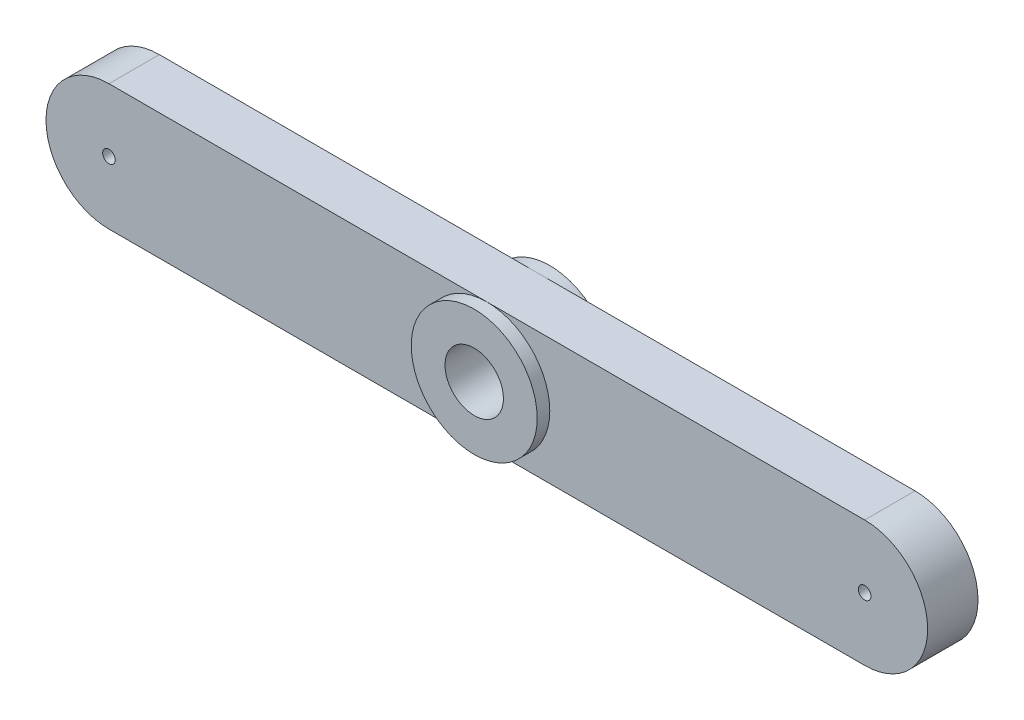
ISO-10303-21;
HEADER;
FILE_DESCRIPTION(('STEP AP214'),'2;1');
FILE_NAME('part.step','',(''),(''),'','','');
FILE_SCHEMA(('AUTOMOTIVE_DESIGN { 1 0 10303 214 1 1 1 1 }'));
ENDSEC;
DATA;
#1=APPLICATION_CONTEXT('core data for automotive mechanical design processes');
#2=APPLICATION_PROTOCOL_DEFINITION('international standard','automotive_design',2000,#1);
#3=PRODUCT_CONTEXT('',#1,'mechanical');
#4=PRODUCT('Part','Part','',(#3));
#5=PRODUCT_RELATED_PRODUCT_CATEGORY('part','',(#4));
#6=PRODUCT_DEFINITION_FORMATION('','',#4);
#7=PRODUCT_DEFINITION_CONTEXT('part definition',#1,'design');
#8=PRODUCT_DEFINITION('design','',#6,#7);
#9=PRODUCT_DEFINITION_SHAPE('','',#8);
#10=(LENGTH_UNIT() NAMED_UNIT(*) SI_UNIT(.MILLI.,.METRE.));
#11=(NAMED_UNIT(*) PLANE_ANGLE_UNIT() SI_UNIT($,.RADIAN.));
#12=(NAMED_UNIT(*) SI_UNIT($,.STERADIAN.) SOLID_ANGLE_UNIT());
#13=UNCERTAINTY_MEASURE_WITH_UNIT(LENGTH_MEASURE(1.E-05),#10,'distance_accuracy_value','');
#14=(GEOMETRIC_REPRESENTATION_CONTEXT(3) GLOBAL_UNCERTAINTY_ASSIGNED_CONTEXT((#13)) GLOBAL_UNIT_ASSIGNED_CONTEXT((#10,
#11,#12)) REPRESENTATION_CONTEXT('',''));
#15=CARTESIAN_POINT('',(0.,0.,0.));
#16=DIRECTION('',(0.,0.,1.));
#17=DIRECTION('',(1.,0.,0.));
#18=AXIS2_PLACEMENT_3D('',#15,#16,#17);
#19=CARTESIAN_POINT('',(0.,0.,1.5));
#20=DIRECTION('',(0.,0.,-1.));
#21=DIRECTION('',(-1.,0.,0.));
#22=AXIS2_PLACEMENT_3D('',#19,#20,#21);
#23=CYLINDRICAL_SURFACE('',#22,2.5);
#24=CARTESIAN_POINT('',(0.,0.,-1.5));
#25=DIRECTION('',(0.,0.,1.));
#26=DIRECTION('',(1.,0.,0.));
#27=AXIS2_PLACEMENT_3D('',#24,#25,#26);
#28=CIRCLE('',#27,2.5);
#29=CARTESIAN_POINT('',(2.5,0.,-1.5));
#30=VERTEX_POINT('',#29);
#31=EDGE_CURVE('E142',#30,#30,#28,.T.);
#32=ORIENTED_EDGE('',*,*,#31,.T.);
#33=EDGE_LOOP('',(#32));
#34=FACE_BOUND('',#33,.T.);
#35=CARTESIAN_POINT('',(0.,0.,-1.));
#36=DIRECTION('',(0.,0.,1.));
#37=DIRECTION('',(1.,0.,0.));
#38=AXIS2_PLACEMENT_3D('',#35,#36,#37);
#39=CIRCLE('',#38,2.5);
#40=CARTESIAN_POINT('',(0.,-2.5,-1.));
#41=VERTEX_POINT('',#40);
#42=CARTESIAN_POINT('',(0.,2.5,-1.));
#43=VERTEX_POINT('',#42);
#44=EDGE_CURVE('E95',#41,#43,#39,.T.);
#45=ORIENTED_EDGE('',*,*,#44,.F.);
#46=CARTESIAN_POINT('',(0.,0.,-1.));
#47=DIRECTION('',(0.,0.,1.));
#48=DIRECTION('',(1.,0.,0.));
#49=AXIS2_PLACEMENT_3D('',#46,#47,#48);
#50=CIRCLE('',#49,2.5);
#51=EDGE_CURVE('E97',#43,#41,#50,.T.);
#52=ORIENTED_EDGE('',*,*,#51,.F.);
#53=EDGE_LOOP('',(#45,#52));
#54=FACE_BOUND('',#53,.T.);
#55=ADVANCED_FACE('F59',(#34,#54),#23,.T.);
#56=CARTESIAN_POINT('',(0.,2.5,1.));
#57=DIRECTION('',(0.,1.,0.));
#58=DIRECTION('',(0.,0.,1.));
#59=AXIS2_PLACEMENT_3D('',#56,#57,#58);
#60=PLANE('',#59);
#61=DIRECTION('',(1.,0.,0.));
#62=VECTOR('',#61,1.);
#63=CARTESIAN_POINT('',(0.,2.5,-1.));
#64=LINE('',#63,#62);
#65=CARTESIAN_POINT('',(-15.,2.5,-1.));
#66=VERTEX_POINT('',#65);
#67=EDGE_CURVE('E117',#66,#43,#64,.T.);
#68=ORIENTED_EDGE('',*,*,#67,.F.);
#69=DIRECTION('',(0.,0.,-1.));
#70=VECTOR('',#69,1.);
#71=CARTESIAN_POINT('',(-15.,2.5,1.));
#72=LINE('',#71,#70);
#73=CARTESIAN_POINT('',(-15.,2.5,1.));
#74=VERTEX_POINT('',#73);
#75=EDGE_CURVE('E12',#74,#66,#72,.T.);
#76=ORIENTED_EDGE('',*,*,#75,.F.);
#77=DIRECTION('',(1.,0.,0.));
#78=VECTOR('',#77,1.);
#79=CARTESIAN_POINT('',(0.,2.5,1.));
#80=LINE('',#79,#78);
#81=CARTESIAN_POINT('',(0.,2.5,1.));
#82=VERTEX_POINT('',#81);
#83=EDGE_CURVE('E153',#74,#82,#80,.T.);
#84=ORIENTED_EDGE('',*,*,#83,.T.);
#85=DIRECTION('',(1.,0.,0.));
#86=VECTOR('',#85,1.);
#87=CARTESIAN_POINT('',(0.,2.5,1.));
#88=LINE('',#87,#86);
#89=CARTESIAN_POINT('',(15.,2.5,1.));
#90=VERTEX_POINT('',#89);
#91=EDGE_CURVE('E184',#82,#90,#88,.T.);
#92=ORIENTED_EDGE('',*,*,#91,.T.);
#93=DIRECTION('',(0.,0.,-1.));
#94=VECTOR('',#93,1.);
#95=CARTESIAN_POINT('',(15.,2.5,1.));
#96=LINE('',#95,#94);
#97=CARTESIAN_POINT('',(15.,2.5,-1.));
#98=VERTEX_POINT('',#97);
#99=EDGE_CURVE('E134',#90,#98,#96,.T.);
#100=ORIENTED_EDGE('',*,*,#99,.T.);
#101=DIRECTION('',(1.,0.,0.));
#102=VECTOR('',#101,1.);
#103=CARTESIAN_POINT('',(0.,2.5,-1.));
#104=LINE('',#103,#102);
#105=EDGE_CURVE('E103',#43,#98,#104,.T.);
#106=ORIENTED_EDGE('',*,*,#105,.F.);
#107=EDGE_LOOP('',(#68,#76,#84,#92,#100,#106));
#108=FACE_BOUND('',#107,.T.);
#109=ADVANCED_FACE('F169',(#108),#60,.T.);
#110=CARTESIAN_POINT('',(-15.,0.,1.));
#111=DIRECTION('',(0.,0.,-1.));
#112=DIRECTION('',(-1.,0.,0.));
#113=AXIS2_PLACEMENT_3D('',#110,#111,#112);
#114=CYLINDRICAL_SURFACE('',#113,2.5);
#115=CARTESIAN_POINT('',(-15.,0.,-1.));
#116=DIRECTION('',(0.,0.,1.));
#117=DIRECTION('',(1.,0.,0.));
#118=AXIS2_PLACEMENT_3D('',#115,#116,#117);
#119=CIRCLE('',#118,2.5);
#120=CARTESIAN_POINT('',(-15.,-2.5,-1.));
#121=VERTEX_POINT('',#120);
#122=EDGE_CURVE('E112',#66,#121,#119,.T.);
#123=ORIENTED_EDGE('',*,*,#122,.T.);
#124=DIRECTION('',(0.,0.,-1.));
#125=VECTOR('',#124,1.);
#126=CARTESIAN_POINT('',(-15.,-2.5,1.));
#127=LINE('',#126,#125);
#128=CARTESIAN_POINT('',(-15.,-2.5,1.));
#129=VERTEX_POINT('',#128);
#130=EDGE_CURVE('E68',#129,#121,#127,.T.);
#131=ORIENTED_EDGE('',*,*,#130,.F.);
#132=CARTESIAN_POINT('',(-15.,0.,1.));
#133=DIRECTION('',(0.,0.,1.));
#134=DIRECTION('',(1.,0.,0.));
#135=AXIS2_PLACEMENT_3D('',#132,#133,#134);
#136=CIRCLE('',#135,2.5);
#137=EDGE_CURVE('E156',#74,#129,#136,.T.);
#138=ORIENTED_EDGE('',*,*,#137,.F.);
#139=ORIENTED_EDGE('',*,*,#75,.T.);
#140=EDGE_LOOP('',(#123,#131,#138,#139));
#141=FACE_BOUND('',#140,.T.);
#142=ADVANCED_FACE('F166',(#141),#114,.T.);
#143=CARTESIAN_POINT('',(0.,-2.5,1.));
#144=DIRECTION('',(0.,1.,0.));
#145=DIRECTION('',(0.,0.,1.));
#146=AXIS2_PLACEMENT_3D('',#143,#144,#145);
#147=PLANE('',#146);
#148=DIRECTION('',(1.,0.,0.));
#149=VECTOR('',#148,1.);
#150=CARTESIAN_POINT('',(0.,-2.5,-1.));
#151=LINE('',#150,#149);
#152=EDGE_CURVE('E90',#121,#41,#151,.T.);
#153=ORIENTED_EDGE('',*,*,#152,.T.);
#154=DIRECTION('',(1.,0.,0.));
#155=VECTOR('',#154,1.);
#156=CARTESIAN_POINT('',(0.,-2.5,-1.));
#157=LINE('',#156,#155);
#158=CARTESIAN_POINT('',(15.,-2.5,-1.));
#159=VERTEX_POINT('',#158);
#160=EDGE_CURVE('E102',#41,#159,#157,.T.);
#161=ORIENTED_EDGE('',*,*,#160,.T.);
#162=DIRECTION('',(0.,0.,-1.));
#163=VECTOR('',#162,1.);
#164=CARTESIAN_POINT('',(15.,-2.5,1.));
#165=LINE('',#164,#163);
#166=CARTESIAN_POINT('',(15.,-2.5,1.));
#167=VERTEX_POINT('',#166);
#168=EDGE_CURVE('E132',#167,#159,#165,.T.);
#169=ORIENTED_EDGE('',*,*,#168,.F.);
#170=DIRECTION('',(1.,0.,0.));
#171=VECTOR('',#170,1.);
#172=CARTESIAN_POINT('',(0.,-2.5,1.));
#173=LINE('',#172,#171);
#174=CARTESIAN_POINT('',(0.,-2.5,1.));
#175=VERTEX_POINT('',#174);
#176=EDGE_CURVE('E178',#175,#167,#173,.T.);
#177=ORIENTED_EDGE('',*,*,#176,.F.);
#178=DIRECTION('',(1.,0.,0.));
#179=VECTOR('',#178,1.);
#180=CARTESIAN_POINT('',(0.,-2.5,1.));
#181=LINE('',#180,#179);
#182=EDGE_CURVE('E76',#129,#175,#181,.T.);
#183=ORIENTED_EDGE('',*,*,#182,.F.);
#184=ORIENTED_EDGE('',*,*,#130,.T.);
#185=EDGE_LOOP('',(#153,#161,#169,#177,#183,#184));
#186=FACE_BOUND('',#185,.T.);
#187=ADVANCED_FACE('F106',(#186),#147,.F.);
#188=CARTESIAN_POINT('',(-15.,0.,1.));
#189=DIRECTION('',(0.,0.,-1.));
#190=DIRECTION('',(-1.,0.,0.));
#191=AXIS2_PLACEMENT_3D('',#188,#189,#190);
#192=CYLINDRICAL_SURFACE('',#191,0.25);
#193=CARTESIAN_POINT('',(-15.,0.,1.));
#194=DIRECTION('',(0.,0.,1.));
#195=DIRECTION('',(1.,0.,0.));
#196=AXIS2_PLACEMENT_3D('',#193,#194,#195);
#197=CIRCLE('',#196,0.25);
#198=CARTESIAN_POINT('',(-14.75,0.,1.));
#199=VERTEX_POINT('',#198);
#200=EDGE_CURVE('E118',#199,#199,#197,.T.);
#201=ORIENTED_EDGE('',*,*,#200,.T.);
#202=EDGE_LOOP('',(#201));
#203=FACE_BOUND('',#202,.T.);
#204=CARTESIAN_POINT('',(-15.,0.,-1.));
#205=DIRECTION('',(0.,0.,1.));
#206=DIRECTION('',(1.,0.,0.));
#207=AXIS2_PLACEMENT_3D('',#204,#205,#206);
#208=CIRCLE('',#207,0.25);
#209=CARTESIAN_POINT('',(-14.75,0.,-1.));
#210=VERTEX_POINT('',#209);
#211=EDGE_CURVE('E148',#210,#210,#208,.T.);
#212=ORIENTED_EDGE('',*,*,#211,.F.);
#213=EDGE_LOOP('',(#212));
#214=FACE_BOUND('',#213,.T.);
#215=ADVANCED_FACE('F61',(#203,#214),#192,.F.);
#216=CARTESIAN_POINT('',(0.,0.,1.));
#217=DIRECTION('',(0.,0.,1.));
#218=DIRECTION('',(1.,0.,0.));
#219=AXIS2_PLACEMENT_3D('',#216,#217,#218);
#220=PLANE('',#219);
#221=ORIENTED_EDGE('',*,*,#200,.F.);
#222=EDGE_LOOP('',(#221));
#223=FACE_BOUND('',#222,.T.);
#224=ORIENTED_EDGE('',*,*,#83,.F.);
#225=ORIENTED_EDGE('',*,*,#137,.T.);
#226=ORIENTED_EDGE('',*,*,#182,.T.);
#227=CARTESIAN_POINT('',(0.,0.,1.));
#228=DIRECTION('',(0.,0.,1.));
#229=DIRECTION('',(1.,0.,0.));
#230=AXIS2_PLACEMENT_3D('',#227,#228,#229);
#231=CIRCLE('',#230,2.5);
#232=EDGE_CURVE('E159',#82,#175,#231,.T.);
#233=ORIENTED_EDGE('',*,*,#232,.F.);
#234=EDGE_LOOP('',(#224,#225,#226,#233));
#235=FACE_BOUND('',#234,.T.);
#236=ADVANCED_FACE('F202',(#223,#235),#220,.T.);
#237=CARTESIAN_POINT('',(0.,0.,-1.));
#238=DIRECTION('',(0.,0.,1.));
#239=DIRECTION('',(1.,0.,0.));
#240=AXIS2_PLACEMENT_3D('',#237,#238,#239);
#241=PLANE('',#240);
#242=ORIENTED_EDGE('',*,*,#211,.T.);
#243=EDGE_LOOP('',(#242));
#244=FACE_BOUND('',#243,.T.);
#245=ORIENTED_EDGE('',*,*,#67,.T.);
#246=ORIENTED_EDGE('',*,*,#51,.T.);
#247=ORIENTED_EDGE('',*,*,#152,.F.);
#248=ORIENTED_EDGE('',*,*,#122,.F.);
#249=EDGE_LOOP('',(#245,#246,#247,#248));
#250=FACE_BOUND('',#249,.T.);
#251=ADVANCED_FACE('F115',(#244,#250),#241,.F.);
#252=CARTESIAN_POINT('',(0.,0.,1.5));
#253=DIRECTION('',(0.,0.,1.));
#254=DIRECTION('',(1.,0.,0.));
#255=AXIS2_PLACEMENT_3D('',#252,#253,#254);
#256=PLANE('',#255);
#257=CARTESIAN_POINT('',(0.,0.,1.5));
#258=DIRECTION('',(0.,0.,1.));
#259=DIRECTION('',(1.,0.,0.));
#260=AXIS2_PLACEMENT_3D('',#257,#258,#259);
#261=CIRCLE('',#260,2.5);
#262=CARTESIAN_POINT('',(2.5,0.,1.5));
#263=VERTEX_POINT('',#262);
#264=EDGE_CURVE('E145',#263,#263,#261,.T.);
#265=ORIENTED_EDGE('',*,*,#264,.T.);
#266=EDGE_LOOP('',(#265));
#267=FACE_BOUND('',#266,.T.);
#268=CARTESIAN_POINT('',(0.,0.,1.5));
#269=DIRECTION('',(0.,0.,1.));
#270=DIRECTION('',(1.,0.,0.));
#271=AXIS2_PLACEMENT_3D('',#268,#269,#270);
#272=CIRCLE('',#271,1.15951383088513);
#273=CARTESIAN_POINT('',(1.15951383088513,0.,1.5));
#274=VERTEX_POINT('',#273);
#275=EDGE_CURVE('E139',#274,#274,#272,.T.);
#276=ORIENTED_EDGE('',*,*,#275,.F.);
#277=EDGE_LOOP('',(#276));
#278=FACE_BOUND('',#277,.T.);
#279=ADVANCED_FACE('F216',(#267,#278),#256,.T.);
#280=CARTESIAN_POINT('',(0.,0.,-1.5));
#281=DIRECTION('',(0.,0.,1.));
#282=DIRECTION('',(1.,0.,0.));
#283=AXIS2_PLACEMENT_3D('',#280,#281,#282);
#284=PLANE('',#283);
#285=ORIENTED_EDGE('',*,*,#31,.F.);
#286=EDGE_LOOP('',(#285));
#287=FACE_BOUND('',#286,.T.);
#288=CARTESIAN_POINT('',(0.,0.,-1.5));
#289=DIRECTION('',(0.,0.,1.));
#290=DIRECTION('',(1.,0.,0.));
#291=AXIS2_PLACEMENT_3D('',#288,#289,#290);
#292=CIRCLE('',#291,1.15951383088513);
#293=CARTESIAN_POINT('',(1.15951383088513,0.,-1.5));
#294=VERTEX_POINT('',#293);
#295=EDGE_CURVE('E138',#294,#294,#292,.T.);
#296=ORIENTED_EDGE('',*,*,#295,.T.);
#297=EDGE_LOOP('',(#296));
#298=FACE_BOUND('',#297,.T.);
#299=ADVANCED_FACE('F212',(#287,#298),#284,.F.);
#300=ORIENTED_EDGE('',*,*,#232,.T.);
#301=CARTESIAN_POINT('',(0.,0.,1.));
#302=DIRECTION('',(0.,0.,1.));
#303=DIRECTION('',(1.,0.,0.));
#304=AXIS2_PLACEMENT_3D('',#301,#302,#303);
#305=CIRCLE('',#304,2.5);
#306=EDGE_CURVE('E181',#175,#82,#305,.T.);
#307=ORIENTED_EDGE('',*,*,#306,.T.);
#308=EDGE_LOOP('',(#300,#307));
#309=FACE_BOUND('',#308,.T.);
#310=ORIENTED_EDGE('',*,*,#264,.F.);
#311=EDGE_LOOP('',(#310));
#312=FACE_BOUND('',#311,.T.);
#313=ADVANCED_FACE('F204',(#309,#312),#23,.T.);
#314=CARTESIAN_POINT('',(0.,0.,1.5));
#315=DIRECTION('',(0.,0.,-1.));
#316=DIRECTION('',(-1.,0.,0.));
#317=AXIS2_PLACEMENT_3D('',#314,#315,#316);
#318=CYLINDRICAL_SURFACE('',#317,1.15951383088513);
#319=ORIENTED_EDGE('',*,*,#275,.T.);
#320=EDGE_LOOP('',(#319));
#321=FACE_BOUND('',#320,.T.);
#322=ORIENTED_EDGE('',*,*,#295,.F.);
#323=EDGE_LOOP('',(#322));
#324=FACE_BOUND('',#323,.T.);
#325=ADVANCED_FACE('F211',(#321,#324),#318,.F.);
#326=CARTESIAN_POINT('',(15.,0.,1.));
#327=DIRECTION('',(0.,0.,-1.));
#328=DIRECTION('',(-1.,0.,0.));
#329=AXIS2_PLACEMENT_3D('',#326,#327,#328);
#330=CYLINDRICAL_SURFACE('',#329,2.5);
#331=CARTESIAN_POINT('',(15.,0.,-1.));
#332=DIRECTION('',(0.,0.,1.));
#333=DIRECTION('',(1.,0.,0.));
#334=AXIS2_PLACEMENT_3D('',#331,#332,#333);
#335=CIRCLE('',#334,2.5);
#336=EDGE_CURVE('E124',#159,#98,#335,.T.);
#337=ORIENTED_EDGE('',*,*,#336,.T.);
#338=ORIENTED_EDGE('',*,*,#99,.F.);
#339=CARTESIAN_POINT('',(15.,0.,1.));
#340=DIRECTION('',(0.,0.,1.));
#341=DIRECTION('',(1.,0.,0.));
#342=AXIS2_PLACEMENT_3D('',#339,#340,#341);
#343=CIRCLE('',#342,2.5);
#344=EDGE_CURVE('E128',#167,#90,#343,.T.);
#345=ORIENTED_EDGE('',*,*,#344,.F.);
#346=ORIENTED_EDGE('',*,*,#168,.T.);
#347=EDGE_LOOP('',(#337,#338,#345,#346));
#348=FACE_BOUND('',#347,.T.);
#349=ADVANCED_FACE('F197',(#348),#330,.T.);
#350=CARTESIAN_POINT('',(15.,0.,1.));
#351=DIRECTION('',(0.,0.,-1.));
#352=DIRECTION('',(-1.,0.,0.));
#353=AXIS2_PLACEMENT_3D('',#350,#351,#352);
#354=CYLINDRICAL_SURFACE('',#353,0.25);
#355=CARTESIAN_POINT('',(15.,0.,1.));
#356=DIRECTION('',(0.,0.,1.));
#357=DIRECTION('',(1.,0.,0.));
#358=AXIS2_PLACEMENT_3D('',#355,#356,#357);
#359=CIRCLE('',#358,0.25);
#360=CARTESIAN_POINT('',(15.25,0.,1.));
#361=VERTEX_POINT('',#360);
#362=EDGE_CURVE('E135',#361,#361,#359,.T.);
#363=ORIENTED_EDGE('',*,*,#362,.T.);
#364=EDGE_LOOP('',(#363));
#365=FACE_BOUND('',#364,.T.);
#366=CARTESIAN_POINT('',(15.,0.,-1.));
#367=DIRECTION('',(0.,0.,1.));
#368=DIRECTION('',(1.,0.,0.));
#369=AXIS2_PLACEMENT_3D('',#366,#367,#368);
#370=CIRCLE('',#369,0.25);
#371=CARTESIAN_POINT('',(15.25,0.,-1.));
#372=VERTEX_POINT('',#371);
#373=EDGE_CURVE('E125',#372,#372,#370,.T.);
#374=ORIENTED_EDGE('',*,*,#373,.F.);
#375=EDGE_LOOP('',(#374));
#376=FACE_BOUND('',#375,.T.);
#377=ADVANCED_FACE('F300',(#365,#376),#354,.F.);
#378=CARTESIAN_POINT('',(0.,0.,1.));
#379=DIRECTION('',(0.,0.,1.));
#380=DIRECTION('',(1.,0.,0.));
#381=AXIS2_PLACEMENT_3D('',#378,#379,#380);
#382=PLANE('',#381);
#383=ORIENTED_EDGE('',*,*,#344,.T.);
#384=ORIENTED_EDGE('',*,*,#91,.F.);
#385=ORIENTED_EDGE('',*,*,#306,.F.);
#386=ORIENTED_EDGE('',*,*,#176,.T.);
#387=EDGE_LOOP('',(#383,#384,#385,#386));
#388=FACE_BOUND('',#387,.T.);
#389=ORIENTED_EDGE('',*,*,#362,.F.);
#390=EDGE_LOOP('',(#389));
#391=FACE_BOUND('',#390,.T.);
#392=ADVANCED_FACE('F191',(#388,#391),#382,.T.);
#393=CARTESIAN_POINT('',(0.,0.,-1.));
#394=DIRECTION('',(0.,0.,1.));
#395=DIRECTION('',(1.,0.,0.));
#396=AXIS2_PLACEMENT_3D('',#393,#394,#395);
#397=PLANE('',#396);
#398=ORIENTED_EDGE('',*,*,#336,.F.);
#399=ORIENTED_EDGE('',*,*,#160,.F.);
#400=ORIENTED_EDGE('',*,*,#44,.T.);
#401=ORIENTED_EDGE('',*,*,#105,.T.);
#402=EDGE_LOOP('',(#398,#399,#400,#401));
#403=FACE_BOUND('',#402,.T.);
#404=ORIENTED_EDGE('',*,*,#373,.T.);
#405=EDGE_LOOP('',(#404));
#406=FACE_BOUND('',#405,.T.);
#407=ADVANCED_FACE('F121',(#403,#406),#397,.F.);
#408=CLOSED_SHELL('',(#55,#109,#142,#187,#215,#236,#251,#279,#299,#313,#325,#349,#377,#392,#407));
#409=MANIFOLD_SOLID_BREP('B2',#408);
#410=ADVANCED_BREP_SHAPE_REPRESENTATION('',(#18,#409),#14);
#411=SHAPE_DEFINITION_REPRESENTATION(#9,#410);
ENDSEC;
END-ISO-10303-21;
